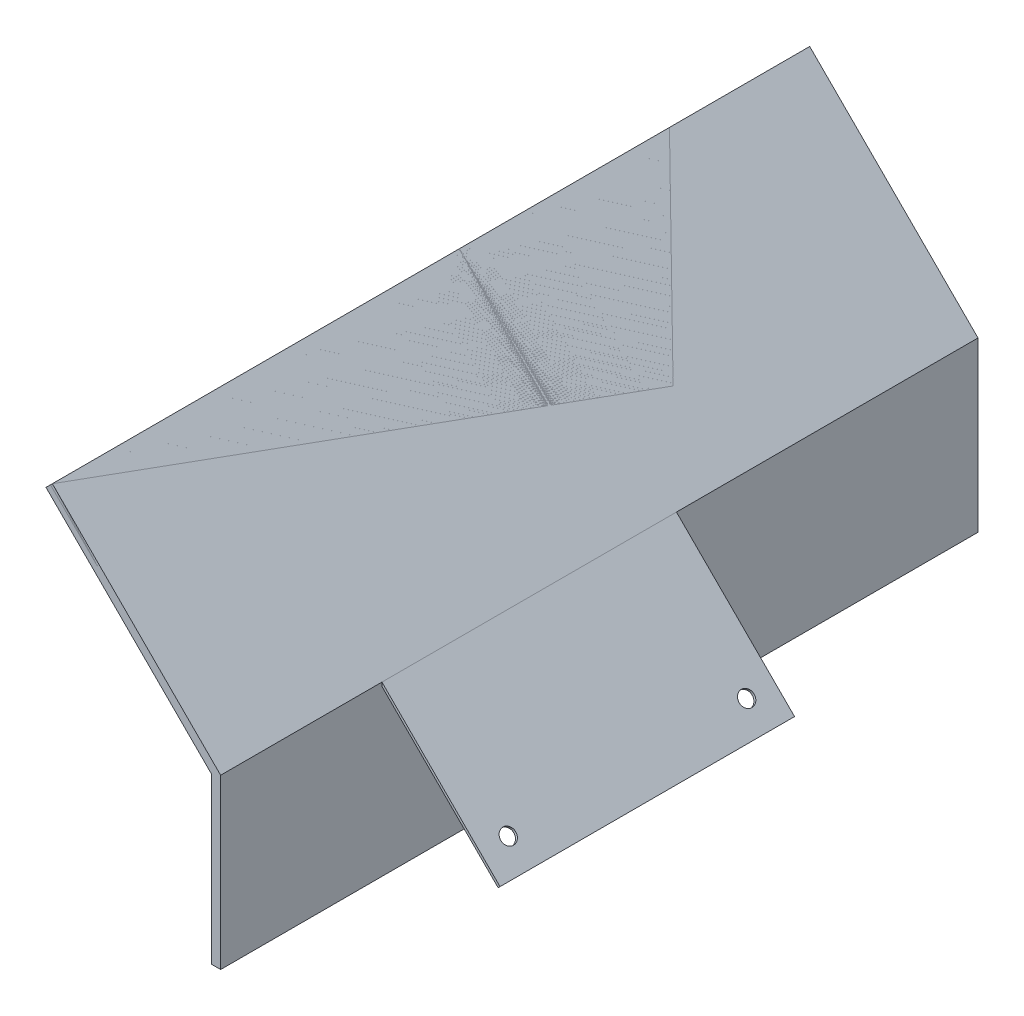
ISO-10303-21;
HEADER;
FILE_DESCRIPTION(('STEP AP214'),'2;1');
FILE_NAME('part.step','',(''),(''),'','','');
FILE_SCHEMA(('AUTOMOTIVE_DESIGN { 1 0 10303 214 1 1 1 1 }'));
ENDSEC;
DATA;
#1=APPLICATION_CONTEXT('core data for automotive mechanical design processes');
#2=APPLICATION_PROTOCOL_DEFINITION('international standard','automotive_design',2000,#1);
#3=PRODUCT_CONTEXT('',#1,'mechanical');
#4=PRODUCT('Part','Part','',(#3));
#5=PRODUCT_RELATED_PRODUCT_CATEGORY('part','',(#4));
#6=PRODUCT_DEFINITION_FORMATION('','',#4);
#7=PRODUCT_DEFINITION_CONTEXT('part definition',#1,'design');
#8=PRODUCT_DEFINITION('design','',#6,#7);
#9=PRODUCT_DEFINITION_SHAPE('','',#8);
#10=(LENGTH_UNIT() NAMED_UNIT(*) SI_UNIT(.MILLI.,.METRE.));
#11=(NAMED_UNIT(*) PLANE_ANGLE_UNIT() SI_UNIT($,.RADIAN.));
#12=(NAMED_UNIT(*) SI_UNIT($,.STERADIAN.) SOLID_ANGLE_UNIT());
#13=UNCERTAINTY_MEASURE_WITH_UNIT(LENGTH_MEASURE(1.E-05),#10,'distance_accuracy_value','');
#14=(GEOMETRIC_REPRESENTATION_CONTEXT(3) GLOBAL_UNCERTAINTY_ASSIGNED_CONTEXT((#13)) GLOBAL_UNIT_ASSIGNED_CONTEXT((#10,
#11,#12)) REPRESENTATION_CONTEXT('',''));
#15=CARTESIAN_POINT('',(0.,0.,0.));
#16=DIRECTION('',(0.,0.,1.));
#17=DIRECTION('',(1.,0.,0.));
#18=AXIS2_PLACEMENT_3D('',#15,#16,#17);
#19=CARTESIAN_POINT('',(-44.1236816385379,-78.9253169424674,-73.025));
#20=DIRECTION('',(0.,0.,-1.));
#21=DIRECTION('',(-0.707106781186546,-0.707106781186549,0.));
#22=AXIS2_PLACEMENT_3D('',#19,#20,#21);
#23=PLANE('',#22);
#24=DIRECTION('',(-0.707106781186549,0.707106781186546,0.));
#25=VECTOR('',#24,1.);
#26=CARTESIAN_POINT('',(57.5328176519647,22.7311823480355,-73.025));
#27=LINE('',#26,#25);
#28=CARTESIAN_POINT('',(57.5328176519647,22.7311823480355,-73.025));
#29=VERTEX_POINT('',#28);
#30=CARTESIAN_POINT('',(3.33641809728114,76.9275819027189,-73.025));
#31=VERTEX_POINT('',#30);
#32=EDGE_CURVE('E205',#29,#31,#27,.T.);
#33=ORIENTED_EDGE('',*,*,#32,.T.);
#34=DIRECTION('',(1.,0.,0.));
#35=VECTOR('',#34,1.);
#36=CARTESIAN_POINT('',(-139.7,76.9275819027189,-73.025));
#37=LINE('',#36,#35);
#38=CARTESIAN_POINT('',(1.61939312693272,76.9275819027189,-73.025));
#39=VERTEX_POINT('',#38);
#40=EDGE_CURVE('E159',#39,#31,#37,.T.);
#41=ORIENTED_EDGE('',*,*,#40,.F.);
#42=DIRECTION('',(-0.707106781186549,0.707106781186546,0.));
#43=VECTOR('',#42,1.);
#44=CARTESIAN_POINT('',(56.6743051667905,21.8726698628613,-73.025));
#45=LINE('',#44,#43);
#46=CARTESIAN_POINT('',(56.6743051667905,21.8726698628613,-73.025));
#47=VERTEX_POINT('',#46);
#48=EDGE_CURVE('E202',#47,#39,#45,.T.);
#49=ORIENTED_EDGE('',*,*,#48,.F.);
#50=DIRECTION('',(0.707106781186546,0.707106781186549,0.));
#51=VECTOR('',#50,1.);
#52=CARTESIAN_POINT('',(-44.1236816385379,-78.9253169424674,-73.025));
#53=LINE('',#52,#51);
#54=EDGE_CURVE('E199',#47,#29,#53,.T.);
#55=ORIENTED_EDGE('',*,*,#54,.T.);
#56=EDGE_LOOP('',(#33,#41,#49,#55));
#57=FACE_BOUND('',#56,.T.);
#58=ADVANCED_FACE('F61',(#57),#23,.F.);
#59=CARTESIAN_POINT('',(57.5328176519647,22.7311823480355,-342.9));
#60=DIRECTION('',(-0.707106781186549,0.707106781186546,0.));
#61=DIRECTION('',(0.,0.,1.));
#62=AXIS2_PLACEMENT_3D('',#59,#60,#61);
#63=PLANE('',#62);
#64=DIRECTION('',(0.707106781186546,0.707106781186549,0.));
#65=VECTOR('',#64,1.);
#66=CARTESIAN_POINT('',(-44.1236816385379,-78.9253169424675,-206.375));
#67=LINE('',#66,#65);
#68=CARTESIAN_POINT('',(56.6743051667905,21.8726698628613,-206.375));
#69=VERTEX_POINT('',#68);
#70=CARTESIAN_POINT('',(57.5328176519647,22.7311823480355,-206.375));
#71=VERTEX_POINT('',#70);
#72=EDGE_CURVE('E190',#69,#71,#67,.T.);
#73=ORIENTED_EDGE('',*,*,#72,.T.);
#74=DIRECTION('',(0.,0.,1.));
#75=VECTOR('',#74,1.);
#76=CARTESIAN_POINT('',(57.5328176519647,22.7311823480355,-342.9));
#77=LINE('',#76,#75);
#78=EDGE_CURVE('E13',#71,#29,#77,.T.);
#79=ORIENTED_EDGE('',*,*,#78,.T.);
#80=ORIENTED_EDGE('',*,*,#54,.F.);
#81=DIRECTION('',(0.,0.,1.));
#82=VECTOR('',#81,1.);
#83=CARTESIAN_POINT('',(56.6743051667905,21.8726698628613,-342.9));
#84=LINE('',#83,#82);
#85=EDGE_CURVE('E65',#69,#47,#84,.T.);
#86=ORIENTED_EDGE('',*,*,#85,.F.);
#87=EDGE_LOOP('',(#73,#79,#80,#86));
#88=FACE_BOUND('',#87,.T.);
#89=ADVANCED_FACE('F246',(#88),#63,.F.);
#90=CARTESIAN_POINT('',(4.06400000000002,76.2,-342.9));
#91=DIRECTION('',(0.707106781186546,0.707106781186549,0.));
#92=DIRECTION('',(-0.707106781186549,0.707106781186546,0.));
#93=AXIS2_PLACEMENT_3D('',#90,#91,#92);
#94=PLANE('',#93);
#95=CARTESIAN_POINT('',(48.5525615308955,31.7114384691047,-193.675));
#96=DIRECTION('',(0.707106781186546,0.707106781186549,0.));
#97=DIRECTION('',(-0.707106781186549,0.707106781186546,0.));
#98=AXIS2_PLACEMENT_3D('',#95,#96,#97);
#99=CIRCLE('',#98,3.37819999999999);
#100=CARTESIAN_POINT('',(46.1638134026911,34.100186597309,-193.675));
#101=VERTEX_POINT('',#100);
#102=EDGE_CURVE('E186',#101,#101,#99,.T.);
#103=ORIENTED_EDGE('',*,*,#102,.F.);
#104=EDGE_LOOP('',(#103));
#105=FACE_BOUND('',#104,.T.);
#106=CARTESIAN_POINT('',(48.5525615308955,31.7114384691047,-85.725));
#107=DIRECTION('',(0.707106781186546,0.707106781186549,0.));
#108=DIRECTION('',(-0.707106781186549,0.707106781186546,0.));
#109=AXIS2_PLACEMENT_3D('',#106,#107,#108);
#110=CIRCLE('',#109,3.37819999999999);
#111=CARTESIAN_POINT('',(46.1638134026911,34.100186597309,-85.725));
#112=VERTEX_POINT('',#111);
#113=EDGE_CURVE('E177',#112,#112,#110,.T.);
#114=ORIENTED_EDGE('',*,*,#113,.F.);
#115=EDGE_LOOP('',(#114));
#116=FACE_BOUND('',#115,.T.);
#117=DIRECTION('',(0.707106781186549,-0.707106781186546,0.));
#118=VECTOR('',#117,1.);
#119=CARTESIAN_POINT('',(57.5328176519647,22.7311823480355,-206.375));
#120=LINE('',#119,#118);
#121=CARTESIAN_POINT('',(3.33641809728114,76.9275819027189,-206.375));
#122=VERTEX_POINT('',#121);
#123=EDGE_CURVE('E196',#122,#71,#120,.T.);
#124=ORIENTED_EDGE('',*,*,#123,.F.);
#125=DIRECTION('',(0.,0.,1.));
#126=VECTOR('',#125,1.);
#127=CARTESIAN_POINT('',(3.33641809728114,76.9275819027189,-342.9));
#128=LINE('',#127,#126);
#129=CARTESIAN_POINT('',(3.33641809728114,76.9275819027189,-279.4));
#130=VERTEX_POINT('',#129);
#131=EDGE_CURVE('E182',#122,#130,#128,.F.);
#132=ORIENTED_EDGE('',*,*,#131,.T.);
#133=DIRECTION('',(0.707106781186549,-0.707106781186546,0.));
#134=VECTOR('',#133,1.);
#135=CARTESIAN_POINT('',(4.06400000000002,76.2,-279.4));
#136=LINE('',#135,#134);
#137=CARTESIAN_POINT('',(-72.1360000000002,152.4,-279.4));
#138=VERTEX_POINT('',#137);
#139=EDGE_CURVE('E134',#138,#130,#136,.T.);
#140=ORIENTED_EDGE('',*,*,#139,.F.);
#141=DIRECTION('',(0.,0.,1.));
#142=VECTOR('',#141,1.);
#143=CARTESIAN_POINT('',(-72.1360000000002,152.4,-342.9));
#144=LINE('',#143,#142);
#145=CARTESIAN_POINT('',(-72.1360000000002,152.4,0.));
#146=VERTEX_POINT('',#145);
#147=EDGE_CURVE('E128',#138,#146,#144,.T.);
#148=ORIENTED_EDGE('',*,*,#147,.T.);
#149=DIRECTION('',(-0.707106781186549,0.707106781186546,0.));
#150=VECTOR('',#149,1.);
#151=CARTESIAN_POINT('',(4.06400000000002,76.2,0.));
#152=LINE('',#151,#150);
#153=CARTESIAN_POINT('',(3.33641809728115,76.9275819027189,0.));
#154=VERTEX_POINT('',#153);
#155=EDGE_CURVE('E132',#154,#146,#152,.T.);
#156=ORIENTED_EDGE('',*,*,#155,.F.);
#157=EDGE_CURVE('E138',#154,#31,#128,.F.);
#158=ORIENTED_EDGE('',*,*,#157,.T.);
#159=ORIENTED_EDGE('',*,*,#32,.F.);
#160=ORIENTED_EDGE('',*,*,#78,.F.);
#161=EDGE_LOOP('',(#124,#132,#140,#148,#156,#158,#159,#160));
#162=FACE_BOUND('',#161,.T.);
#163=ADVANCED_FACE('F63',(#105,#116,#162),#94,.T.);
#164=CARTESIAN_POINT('',(56.6743051667905,21.8726698628613,-342.9));
#165=DIRECTION('',(0.707106781186546,0.707106781186549,0.));
#166=DIRECTION('',(-0.707106781186549,0.707106781186546,0.));
#167=AXIS2_PLACEMENT_3D('',#164,#165,#166);
#168=PLANE('',#167);
#169=CARTESIAN_POINT('',(47.6940490457213,30.8529259839304,-193.675));
#170=DIRECTION('',(-0.707106781186546,-0.707106781186549,0.));
#171=DIRECTION('',(0.707106781186549,-0.707106781186546,0.));
#172=AXIS2_PLACEMENT_3D('',#169,#170,#171);
#173=CIRCLE('',#172,3.37819999999999);
#174=CARTESIAN_POINT('',(50.0827971739257,28.464177855726,-193.675));
#175=VERTEX_POINT('',#174);
#176=EDGE_CURVE('E173',#175,#175,#173,.T.);
#177=ORIENTED_EDGE('',*,*,#176,.F.);
#178=EDGE_LOOP('',(#177));
#179=FACE_BOUND('',#178,.T.);
#180=CARTESIAN_POINT('',(47.6940490457213,30.8529259839304,-85.725));
#181=DIRECTION('',(-0.707106781186546,-0.707106781186549,0.));
#182=DIRECTION('',(0.707106781186549,-0.707106781186546,0.));
#183=AXIS2_PLACEMENT_3D('',#180,#181,#182);
#184=CIRCLE('',#183,3.37819999999999);
#185=CARTESIAN_POINT('',(50.0827971739257,28.4641778557261,-85.725));
#186=VERTEX_POINT('',#185);
#187=EDGE_CURVE('E178',#186,#186,#184,.T.);
#188=ORIENTED_EDGE('',*,*,#187,.F.);
#189=EDGE_LOOP('',(#188));
#190=FACE_BOUND('',#189,.T.);
#191=ORIENTED_EDGE('',*,*,#48,.T.);
#192=DIRECTION('',(0.,0.,-1.));
#193=VECTOR('',#192,1.);
#194=CARTESIAN_POINT('',(1.61939312693272,76.9275819027189,-342.9));
#195=LINE('',#194,#193);
#196=CARTESIAN_POINT('',(1.61939312693273,76.9275819027189,0.));
#197=VERTEX_POINT('',#196);
#198=EDGE_CURVE('E165',#197,#39,#195,.T.);
#199=ORIENTED_EDGE('',*,*,#198,.F.);
#200=DIRECTION('',(-0.707106781186549,0.707106781186546,0.));
#201=VECTOR('',#200,1.);
#202=CARTESIAN_POINT('',(3.20548751482581,75.3414875148258,0.));
#203=LINE('',#202,#201);
#204=CARTESIAN_POINT('',(-72.9945124851745,151.541487514826,0.));
#205=VERTEX_POINT('',#204);
#206=EDGE_CURVE('E217',#197,#205,#203,.T.);
#207=ORIENTED_EDGE('',*,*,#206,.T.);
#208=DIRECTION('',(0.,0.,1.));
#209=VECTOR('',#208,1.);
#210=CARTESIAN_POINT('',(-72.9945124851745,151.541487514826,-342.9));
#211=LINE('',#210,#209);
#212=CARTESIAN_POINT('',(-72.9945124851745,151.541487514826,-279.4));
#213=VERTEX_POINT('',#212);
#214=EDGE_CURVE('E144',#213,#205,#211,.T.);
#215=ORIENTED_EDGE('',*,*,#214,.F.);
#216=DIRECTION('',(0.707106781186549,-0.707106781186546,0.));
#217=VECTOR('',#216,1.);
#218=CARTESIAN_POINT('',(3.20548751482581,75.3414875148258,-279.4));
#219=LINE('',#218,#217);
#220=CARTESIAN_POINT('',(1.61939312693272,76.9275819027189,-279.4));
#221=VERTEX_POINT('',#220);
#222=EDGE_CURVE('E226',#213,#221,#219,.T.);
#223=ORIENTED_EDGE('',*,*,#222,.T.);
#224=DIRECTION('',(0.,0.,1.));
#225=VECTOR('',#224,1.);
#226=CARTESIAN_POINT('',(1.61939312693272,76.9275819027189,-342.9));
#227=LINE('',#226,#225);
#228=CARTESIAN_POINT('',(1.61939312693273,76.9275819027189,-206.375));
#229=VERTEX_POINT('',#228);
#230=EDGE_CURVE('E220',#221,#229,#227,.T.);
#231=ORIENTED_EDGE('',*,*,#230,.T.);
#232=DIRECTION('',(0.707106781186549,-0.707106781186546,0.));
#233=VECTOR('',#232,1.);
#234=CARTESIAN_POINT('',(56.6743051667905,21.8726698628613,-206.375));
#235=LINE('',#234,#233);
#236=EDGE_CURVE('E193',#229,#69,#235,.T.);
#237=ORIENTED_EDGE('',*,*,#236,.T.);
#238=ORIENTED_EDGE('',*,*,#85,.T.);
#239=EDGE_LOOP('',(#191,#199,#207,#215,#223,#231,#237,#238));
#240=FACE_BOUND('',#239,.T.);
#241=ADVANCED_FACE('F216',(#179,#190,#240),#168,.F.);
#242=CARTESIAN_POINT('',(-44.1236816385379,-78.9253169424675,-206.375));
#243=DIRECTION('',(0.,0.,1.));
#244=DIRECTION('',(0.707106781186546,0.707106781186549,0.));
#245=AXIS2_PLACEMENT_3D('',#242,#243,#244);
#246=PLANE('',#245);
#247=ORIENTED_EDGE('',*,*,#236,.F.);
#248=DIRECTION('',(1.,0.,0.));
#249=VECTOR('',#248,1.);
#250=CARTESIAN_POINT('',(-139.7,76.9275819027189,-206.375));
#251=LINE('',#250,#249);
#252=EDGE_CURVE('E149',#229,#122,#251,.T.);
#253=ORIENTED_EDGE('',*,*,#252,.T.);
#254=ORIENTED_EDGE('',*,*,#123,.T.);
#255=ORIENTED_EDGE('',*,*,#72,.F.);
#256=EDGE_LOOP('',(#247,#253,#254,#255));
#257=FACE_BOUND('',#256,.T.);
#258=ADVANCED_FACE('F238',(#257),#246,.F.);
#259=CARTESIAN_POINT('',(254.239939830311,237.398816768521,-85.725));
#260=DIRECTION('',(-0.707106781186546,-0.707106781186549,0.));
#261=DIRECTION('',(0.707106781186549,-0.707106781186546,0.));
#262=AXIS2_PLACEMENT_3D('',#259,#260,#261);
#263=CYLINDRICAL_SURFACE('',#262,3.37819999999999);
#264=ORIENTED_EDGE('',*,*,#113,.T.);
#265=EDGE_LOOP('',(#264));
#266=FACE_BOUND('',#265,.T.);
#267=ORIENTED_EDGE('',*,*,#187,.T.);
#268=EDGE_LOOP('',(#267));
#269=FACE_BOUND('',#268,.T.);
#270=ADVANCED_FACE('F258',(#266,#269),#263,.F.);
#271=CARTESIAN_POINT('',(254.239939830311,237.398816768521,-193.675));
#272=DIRECTION('',(-0.707106781186546,-0.707106781186549,0.));
#273=DIRECTION('',(0.707106781186549,-0.707106781186546,0.));
#274=AXIS2_PLACEMENT_3D('',#271,#272,#273);
#275=CYLINDRICAL_SURFACE('',#274,3.37819999999999);
#276=ORIENTED_EDGE('',*,*,#102,.T.);
#277=EDGE_LOOP('',(#276));
#278=FACE_BOUND('',#277,.T.);
#279=ORIENTED_EDGE('',*,*,#176,.T.);
#280=EDGE_LOOP('',(#279));
#281=FACE_BOUND('',#280,.T.);
#282=ADVANCED_FACE('F263',(#278,#281),#275,.F.);
#283=CARTESIAN_POINT('',(-139.7,76.9275819027189,-292.1));
#284=DIRECTION('',(0.,1.,0.));
#285=DIRECTION('',(0.,0.,1.));
#286=AXIS2_PLACEMENT_3D('',#283,#284,#285);
#287=PLANE('',#286);
#288=ORIENTED_EDGE('',*,*,#230,.F.);
#289=DIRECTION('',(1.,0.,0.));
#290=VECTOR('',#289,1.);
#291=CARTESIAN_POINT('',(-139.7,76.9275819027189,-279.4));
#292=LINE('',#291,#290);
#293=EDGE_CURVE('E169',#221,#130,#292,.T.);
#294=ORIENTED_EDGE('',*,*,#293,.T.);
#295=ORIENTED_EDGE('',*,*,#131,.F.);
#296=ORIENTED_EDGE('',*,*,#252,.F.);
#297=EDGE_LOOP('',(#288,#294,#295,#296));
#298=FACE_BOUND('',#297,.T.);
#299=ADVANCED_FACE('F241',(#298),#287,.F.);
#300=CARTESIAN_POINT('',(-139.7,76.9275819027189,0.));
#301=DIRECTION('',(0.,-1.,0.));
#302=DIRECTION('',(0.,0.,-1.));
#303=AXIS2_PLACEMENT_3D('',#300,#301,#302);
#304=PLANE('',#303);
#305=DIRECTION('',(1.,0.,0.));
#306=VECTOR('',#305,1.);
#307=CARTESIAN_POINT('',(-139.7,76.9275819027189,0.));
#308=LINE('',#307,#306);
#309=EDGE_CURVE('E153',#197,#154,#308,.T.);
#310=ORIENTED_EDGE('',*,*,#309,.F.);
#311=ORIENTED_EDGE('',*,*,#198,.T.);
#312=ORIENTED_EDGE('',*,*,#40,.T.);
#313=ORIENTED_EDGE('',*,*,#157,.F.);
#314=EDGE_LOOP('',(#310,#311,#312,#313));
#315=FACE_BOUND('',#314,.T.);
#316=ADVANCED_FACE('F214',(#315),#304,.T.);
#317=CARTESIAN_POINT('',(4.06400000000002,76.2,0.));
#318=DIRECTION('',(0.,0.,-1.));
#319=DIRECTION('',(-0.707106781186549,0.707106781186546,0.));
#320=AXIS2_PLACEMENT_3D('',#317,#318,#319);
#321=PLANE('',#320);
#322=ORIENTED_EDGE('',*,*,#206,.F.);
#323=ORIENTED_EDGE('',*,*,#309,.T.);
#324=ORIENTED_EDGE('',*,*,#155,.T.);
#325=DIRECTION('',(0.707106781186546,0.707106781186549,0.));
#326=VECTOR('',#325,1.);
#327=CARTESIAN_POINT('',(-72.1360000000002,152.4,0.));
#328=LINE('',#327,#326);
#329=EDGE_CURVE('E141',#205,#146,#328,.T.);
#330=ORIENTED_EDGE('',*,*,#329,.F.);
#331=EDGE_LOOP('',(#322,#323,#324,#330));
#332=FACE_BOUND('',#331,.T.);
#333=ADVANCED_FACE('F152',(#332),#321,.F.);
#334=CARTESIAN_POINT('',(-72.1360000000002,152.4,-342.9));
#335=DIRECTION('',(-0.707106781186549,0.707106781186546,0.));
#336=DIRECTION('',(0.,0.,1.));
#337=AXIS2_PLACEMENT_3D('',#334,#335,#336);
#338=PLANE('',#337);
#339=DIRECTION('',(0.707106781186546,0.707106781186549,0.));
#340=VECTOR('',#339,1.);
#341=CARTESIAN_POINT('',(-72.1360000000002,152.4,-279.4));
#342=LINE('',#341,#340);
#343=EDGE_CURVE('E219',#213,#138,#342,.T.);
#344=ORIENTED_EDGE('',*,*,#343,.F.);
#345=ORIENTED_EDGE('',*,*,#214,.T.);
#346=ORIENTED_EDGE('',*,*,#329,.T.);
#347=ORIENTED_EDGE('',*,*,#147,.F.);
#348=EDGE_LOOP('',(#344,#345,#346,#347));
#349=FACE_BOUND('',#348,.T.);
#350=ADVANCED_FACE('F142',(#349),#338,.T.);
#351=CARTESIAN_POINT('',(-75.0096819587424,76.9275819027189,-279.4));
#352=DIRECTION('',(0.,0.,1.));
#353=DIRECTION('',(1.,0.,0.));
#354=AXIS2_PLACEMENT_3D('',#351,#352,#353);
#355=PLANE('',#354);
#356=ORIENTED_EDGE('',*,*,#343,.T.);
#357=ORIENTED_EDGE('',*,*,#139,.T.);
#358=ORIENTED_EDGE('',*,*,#293,.F.);
#359=ORIENTED_EDGE('',*,*,#222,.F.);
#360=EDGE_LOOP('',(#356,#357,#358,#359));
#361=FACE_BOUND('',#360,.T.);
#362=ADVANCED_FACE('F245',(#361),#355,.F.);
#363=CLOSED_SHELL('',(#58,#89,#163,#241,#258,#270,#282,#299,#316,#333,#350,#362));
#364=MANIFOLD_SOLID_BREP('B2',#363);
#365=CARTESIAN_POINT('',(0.,74.5166360825157,-342.9));
#366=DIRECTION('',(-1.,0.,0.));
#367=DIRECTION('',(0.,0.,1.));
#368=AXIS2_PLACEMENT_3D('',#365,#366,#367);
#369=PLANE('',#368);
#370=DIRECTION('',(0.,-1.,0.));
#371=VECTOR('',#370,1.);
#372=CARTESIAN_POINT('',(0.,74.5166360825157,0.));
#373=LINE('',#372,#371);
#374=CARTESIAN_POINT('',(0.,74.5166360825157,0.));
#375=VERTEX_POINT('',#374);
#376=CARTESIAN_POINT('',(0.,0.,0.));
#377=VERTEX_POINT('',#376);
#378=EDGE_CURVE('E499',#375,#377,#373,.T.);
#379=ORIENTED_EDGE('',*,*,#378,.F.);
#380=DIRECTION('',(0.,0.,1.));
#381=VECTOR('',#380,1.);
#382=CARTESIAN_POINT('',(0.,74.5166360825157,-342.9));
#383=LINE('',#382,#381);
#384=CARTESIAN_POINT('',(0.,74.5166360825157,-342.9));
#385=VERTEX_POINT('',#384);
#386=EDGE_CURVE('E59',#385,#375,#383,.T.);
#387=ORIENTED_EDGE('',*,*,#386,.F.);
#388=DIRECTION('',(0.,-1.,0.));
#389=VECTOR('',#388,1.);
#390=CARTESIAN_POINT('',(0.,74.5166360825157,-342.9));
#391=LINE('',#390,#389);
#392=CARTESIAN_POINT('',(0.,0.,-342.9));
#393=VERTEX_POINT('',#392);
#394=EDGE_CURVE('E512',#385,#393,#391,.T.);
#395=ORIENTED_EDGE('',*,*,#394,.T.);
#396=DIRECTION('',(0.,0.,1.));
#397=VECTOR('',#396,1.);
#398=CARTESIAN_POINT('',(0.,0.,-342.9));
#399=LINE('',#398,#397);
#400=EDGE_CURVE('E413',#393,#377,#399,.T.);
#401=ORIENTED_EDGE('',*,*,#400,.T.);
#402=EDGE_LOOP('',(#379,#387,#395,#401));
#403=FACE_BOUND('',#402,.T.);
#404=ADVANCED_FACE('F410',(#403),#369,.T.);
#405=CARTESIAN_POINT('',(0.,74.5166360825157,-342.9));
#406=DIRECTION('',(-0.707106781186547,-0.707106781186548,0.));
#407=DIRECTION('',(0.707106781186548,-0.707106781186547,0.));
#408=AXIS2_PLACEMENT_3D('',#405,#406,#407);
#409=PLANE('',#408);
#410=DIRECTION('',(0.707106781186547,-0.707106781186547,0.));
#411=VECTOR('',#410,1.);
#412=CARTESIAN_POINT('',(0.,74.5166360825157,0.));
#413=LINE('',#412,#411);
#414=CARTESIAN_POINT('',(-75.0096819587424,149.526318041258,0.));
#415=VERTEX_POINT('',#414);
#416=EDGE_CURVE('E447',#415,#375,#413,.T.);
#417=ORIENTED_EDGE('',*,*,#416,.F.);
#418=DIRECTION('',(0.,0.,1.));
#419=VECTOR('',#418,1.);
#420=CARTESIAN_POINT('',(-75.0096819587424,149.526318041258,-342.9));
#421=LINE('',#420,#419);
#422=CARTESIAN_POINT('',(-75.0096819587424,149.526318041258,-342.9));
#423=VERTEX_POINT('',#422);
#424=EDGE_CURVE('E419',#423,#415,#421,.T.);
#425=ORIENTED_EDGE('',*,*,#424,.F.);
#426=DIRECTION('',(0.707106781186838,-0.707106781186257,0.));
#427=VECTOR('',#426,1.);
#428=CARTESIAN_POINT('',(-75.0096819587424,149.526318041258,-342.9));
#429=LINE('',#428,#427);
#430=EDGE_CURVE('E427',#423,#385,#429,.T.);
#431=ORIENTED_EDGE('',*,*,#430,.T.);
#432=ORIENTED_EDGE('',*,*,#386,.T.);
#433=EDGE_LOOP('',(#417,#425,#431,#432));
#434=FACE_BOUND('',#433,.T.);
#435=ADVANCED_FACE('F534',(#434),#409,.T.);
#436=CARTESIAN_POINT('',(-72.1360000000003,152.4,-342.9));
#437=DIRECTION('',(-0.707106781186551,0.707106781186544,0.));
#438=DIRECTION('',(-0.707106781186544,-0.707106781186551,0.));
#439=AXIS2_PLACEMENT_3D('',#436,#437,#438);
#440=PLANE('',#439);
#441=DIRECTION('',(-0.707106781186544,-0.707106781186551,0.));
#442=VECTOR('',#441,1.);
#443=CARTESIAN_POINT('',(-72.1360000000003,152.4,0.));
#444=LINE('',#443,#442);
#445=CARTESIAN_POINT('',(-72.1360000000003,152.4,0.));
#446=VERTEX_POINT('',#445);
#447=EDGE_CURVE('E472',#446,#415,#444,.T.);
#448=ORIENTED_EDGE('',*,*,#447,.F.);
#449=DIRECTION('',(0.,0.,1.));
#450=VECTOR('',#449,1.);
#451=CARTESIAN_POINT('',(-72.1360000000003,152.4,-342.9));
#452=LINE('',#451,#450);
#453=CARTESIAN_POINT('',(-72.1360000000003,152.4,-342.9));
#454=VERTEX_POINT('',#453);
#455=EDGE_CURVE('E467',#454,#446,#452,.T.);
#456=ORIENTED_EDGE('',*,*,#455,.F.);
#457=DIRECTION('',(-0.707106781186544,-0.707106781186551,0.));
#458=VECTOR('',#457,1.);
#459=CARTESIAN_POINT('',(-72.1360000000003,152.4,-342.9));
#460=LINE('',#459,#458);
#461=EDGE_CURVE('E470',#454,#423,#460,.T.);
#462=ORIENTED_EDGE('',*,*,#461,.T.);
#463=ORIENTED_EDGE('',*,*,#424,.T.);
#464=EDGE_LOOP('',(#448,#456,#462,#463));
#465=FACE_BOUND('',#464,.T.);
#466=ADVANCED_FACE('F469',(#465),#440,.T.);
#467=CARTESIAN_POINT('',(4.064,76.2,-342.9));
#468=DIRECTION('',(0.707106781186546,0.707106781186549,0.));
#469=DIRECTION('',(-0.707106781186549,0.707106781186546,0.));
#470=AXIS2_PLACEMENT_3D('',#467,#468,#469);
#471=PLANE('',#470);
#472=DIRECTION('',(-0.707106781186549,0.707106781186546,0.));
#473=VECTOR('',#472,1.);
#474=CARTESIAN_POINT('',(4.064,76.2,0.));
#475=LINE('',#474,#473);
#476=CARTESIAN_POINT('',(4.064,76.2,0.));
#477=VERTEX_POINT('',#476);
#478=EDGE_CURVE('E509',#477,#446,#475,.T.);
#479=ORIENTED_EDGE('',*,*,#478,.F.);
#480=DIRECTION('',(0.,0.,1.));
#481=VECTOR('',#480,1.);
#482=CARTESIAN_POINT('',(4.064,76.2,-342.9));
#483=LINE('',#482,#481);
#484=CARTESIAN_POINT('',(4.064,76.2,-342.9));
#485=VERTEX_POINT('',#484);
#486=EDGE_CURVE('E478',#485,#477,#483,.T.);
#487=ORIENTED_EDGE('',*,*,#486,.F.);
#488=DIRECTION('',(-0.707106781186549,0.707106781186546,0.));
#489=VECTOR('',#488,1.);
#490=CARTESIAN_POINT('',(4.064,76.2,-342.9));
#491=LINE('',#490,#489);
#492=EDGE_CURVE('E485',#485,#454,#491,.T.);
#493=ORIENTED_EDGE('',*,*,#492,.T.);
#494=ORIENTED_EDGE('',*,*,#455,.T.);
#495=EDGE_LOOP('',(#479,#487,#493,#494));
#496=FACE_BOUND('',#495,.T.);
#497=ADVANCED_FACE('F488',(#496),#471,.T.);
#498=CARTESIAN_POINT('',(4.06400000000001,0.,-342.9));
#499=DIRECTION('',(1.,0.,0.));
#500=DIRECTION('',(0.,1.,0.));
#501=AXIS2_PLACEMENT_3D('',#498,#499,#500);
#502=PLANE('',#501);
#503=DIRECTION('',(0.,1.,0.));
#504=VECTOR('',#503,1.);
#505=CARTESIAN_POINT('',(4.06400000000001,0.,0.));
#506=LINE('',#505,#504);
#507=CARTESIAN_POINT('',(4.06400000000001,0.,0.));
#508=VERTEX_POINT('',#507);
#509=EDGE_CURVE('E505',#508,#477,#506,.T.);
#510=ORIENTED_EDGE('',*,*,#509,.F.);
#511=DIRECTION('',(0.,0.,1.));
#512=VECTOR('',#511,1.);
#513=CARTESIAN_POINT('',(4.06400000000001,0.,-342.9));
#514=LINE('',#513,#512);
#515=CARTESIAN_POINT('',(4.06400000000001,0.,-342.9));
#516=VERTEX_POINT('',#515);
#517=EDGE_CURVE('E515',#516,#508,#514,.T.);
#518=ORIENTED_EDGE('',*,*,#517,.F.);
#519=DIRECTION('',(0.,1.,0.));
#520=VECTOR('',#519,1.);
#521=CARTESIAN_POINT('',(4.06400000000001,0.,-342.9));
#522=LINE('',#521,#520);
#523=EDGE_CURVE('E490',#516,#485,#522,.T.);
#524=ORIENTED_EDGE('',*,*,#523,.T.);
#525=ORIENTED_EDGE('',*,*,#486,.T.);
#526=EDGE_LOOP('',(#510,#518,#524,#525));
#527=FACE_BOUND('',#526,.T.);
#528=ADVANCED_FACE('F524',(#527),#502,.T.);
#529=CARTESIAN_POINT('',(0.,0.,-342.9));
#530=DIRECTION('',(0.,-1.,0.));
#531=DIRECTION('',(0.,0.,-1.));
#532=AXIS2_PLACEMENT_3D('',#529,#530,#531);
#533=PLANE('',#532);
#534=DIRECTION('',(1.,0.,0.));
#535=VECTOR('',#534,1.);
#536=CARTESIAN_POINT('',(0.,0.,0.));
#537=LINE('',#536,#535);
#538=EDGE_CURVE('E502',#377,#508,#537,.T.);
#539=ORIENTED_EDGE('',*,*,#538,.F.);
#540=ORIENTED_EDGE('',*,*,#400,.F.);
#541=DIRECTION('',(1.,0.,0.));
#542=VECTOR('',#541,1.);
#543=CARTESIAN_POINT('',(0.,0.,-342.9));
#544=LINE('',#543,#542);
#545=EDGE_CURVE('E494',#393,#516,#544,.T.);
#546=ORIENTED_EDGE('',*,*,#545,.T.);
#547=ORIENTED_EDGE('',*,*,#517,.T.);
#548=EDGE_LOOP('',(#539,#540,#546,#547));
#549=FACE_BOUND('',#548,.T.);
#550=ADVANCED_FACE('F520',(#549),#533,.T.);
#551=CARTESIAN_POINT('',(0.,0.,-342.9));
#552=DIRECTION('',(0.,0.,1.));
#553=DIRECTION('',(1.,0.,0.));
#554=AXIS2_PLACEMENT_3D('',#551,#552,#553);
#555=PLANE('',#554);
#556=ORIENTED_EDGE('',*,*,#394,.F.);
#557=ORIENTED_EDGE('',*,*,#430,.F.);
#558=ORIENTED_EDGE('',*,*,#461,.F.);
#559=ORIENTED_EDGE('',*,*,#492,.F.);
#560=ORIENTED_EDGE('',*,*,#523,.F.);
#561=ORIENTED_EDGE('',*,*,#545,.F.);
#562=EDGE_LOOP('',(#556,#557,#558,#559,#560,#561));
#563=FACE_BOUND('',#562,.T.);
#564=ADVANCED_FACE('F483',(#563),#555,.F.);
#565=CARTESIAN_POINT('',(0.,0.,0.));
#566=DIRECTION('',(0.,0.,1.));
#567=DIRECTION('',(1.,0.,0.));
#568=AXIS2_PLACEMENT_3D('',#565,#566,#567);
#569=PLANE('',#568);
#570=ORIENTED_EDGE('',*,*,#378,.T.);
#571=ORIENTED_EDGE('',*,*,#538,.T.);
#572=ORIENTED_EDGE('',*,*,#509,.T.);
#573=ORIENTED_EDGE('',*,*,#478,.T.);
#574=ORIENTED_EDGE('',*,*,#447,.T.);
#575=ORIENTED_EDGE('',*,*,#416,.T.);
#576=EDGE_LOOP('',(#570,#571,#572,#573,#574,#575));
#577=FACE_BOUND('',#576,.T.);
#578=ADVANCED_FACE('F522',(#577),#569,.T.);
#579=CLOSED_SHELL('',(#404,#435,#466,#497,#528,#550,#564,#578));
#580=MANIFOLD_SOLID_BREP('B7_NOT_SHOWN',#579);
#581=ADVANCED_BREP_SHAPE_REPRESENTATION('',(#18,#364,#580),#14);
#582=SHAPE_DEFINITION_REPRESENTATION(#9,#581);
ENDSEC;
END-ISO-10303-21;
